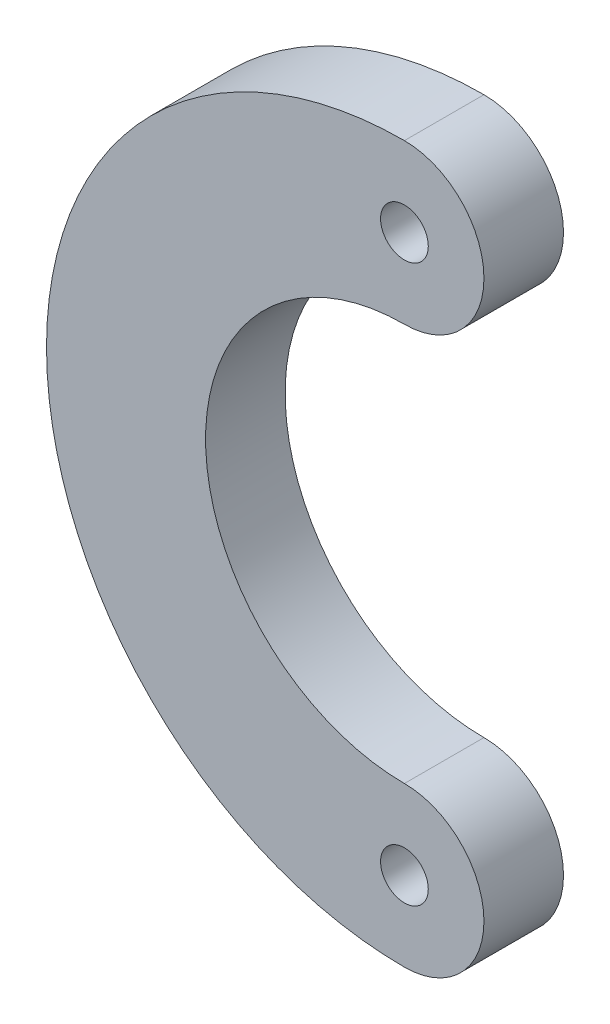
ISO-10303-21;
HEADER;
FILE_DESCRIPTION(('STEP AP214'),'2;1');
FILE_NAME('part.step','',(''),(''),'','','');
FILE_SCHEMA(('AUTOMOTIVE_DESIGN { 1 0 10303 214 1 1 1 1 }'));
ENDSEC;
DATA;
#1=APPLICATION_CONTEXT('core data for automotive mechanical design processes');
#2=APPLICATION_PROTOCOL_DEFINITION('international standard','automotive_design',2000,#1);
#3=PRODUCT_CONTEXT('',#1,'mechanical');
#4=PRODUCT('Part','Part','',(#3));
#5=PRODUCT_RELATED_PRODUCT_CATEGORY('part','',(#4));
#6=PRODUCT_DEFINITION_FORMATION('','',#4);
#7=PRODUCT_DEFINITION_CONTEXT('part definition',#1,'design');
#8=PRODUCT_DEFINITION('design','',#6,#7);
#9=PRODUCT_DEFINITION_SHAPE('','',#8);
#10=(LENGTH_UNIT() NAMED_UNIT(*) SI_UNIT(.MILLI.,.METRE.));
#11=(NAMED_UNIT(*) PLANE_ANGLE_UNIT() SI_UNIT($,.RADIAN.));
#12=(NAMED_UNIT(*) SI_UNIT($,.STERADIAN.) SOLID_ANGLE_UNIT());
#13=UNCERTAINTY_MEASURE_WITH_UNIT(LENGTH_MEASURE(1.E-05),#10,'distance_accuracy_value','');
#14=(GEOMETRIC_REPRESENTATION_CONTEXT(3) GLOBAL_UNCERTAINTY_ASSIGNED_CONTEXT((#13)) GLOBAL_UNIT_ASSIGNED_CONTEXT((#10,
#11,#12)) REPRESENTATION_CONTEXT('',''));
#15=CARTESIAN_POINT('',(0.,0.,0.));
#16=DIRECTION('',(0.,0.,1.));
#17=DIRECTION('',(1.,0.,0.));
#18=AXIS2_PLACEMENT_3D('',#15,#16,#17);
#19=CARTESIAN_POINT('',(0.,-17.5,5.));
#20=DIRECTION('',(0.,0.,-1.));
#21=DIRECTION('',(-1.,0.,0.));
#22=AXIS2_PLACEMENT_3D('',#19,#20,#21);
#23=CYLINDRICAL_SURFACE('',#22,5.);
#24=CARTESIAN_POINT('',(0.,-17.5,0.));
#25=DIRECTION('',(0.,0.,1.));
#26=DIRECTION('',(1.,0.,0.));
#27=AXIS2_PLACEMENT_3D('',#24,#25,#26);
#28=CIRCLE('',#27,5.);
#29=CARTESIAN_POINT('',(0.,-22.5,0.));
#30=VERTEX_POINT('',#29);
#31=CARTESIAN_POINT('',(0.,-12.5,0.));
#32=VERTEX_POINT('',#31);
#33=EDGE_CURVE('E98',#30,#32,#28,.T.);
#34=ORIENTED_EDGE('',*,*,#33,.T.);
#35=DIRECTION('',(0.,0.,-1.));
#36=VECTOR('',#35,1.);
#37=CARTESIAN_POINT('',(0.,-12.5,5.));
#38=LINE('',#37,#36);
#39=CARTESIAN_POINT('',(0.,-12.5,5.));
#40=VERTEX_POINT('',#39);
#41=EDGE_CURVE('E11',#40,#32,#38,.T.);
#42=ORIENTED_EDGE('',*,*,#41,.F.);
#43=CARTESIAN_POINT('',(0.,-17.5,5.));
#44=DIRECTION('',(0.,0.,1.));
#45=DIRECTION('',(1.,0.,0.));
#46=AXIS2_PLACEMENT_3D('',#43,#44,#45);
#47=CIRCLE('',#46,5.);
#48=CARTESIAN_POINT('',(0.,-22.5,5.));
#49=VERTEX_POINT('',#48);
#50=EDGE_CURVE('E86',#49,#40,#47,.T.);
#51=ORIENTED_EDGE('',*,*,#50,.F.);
#52=DIRECTION('',(0.,0.,-1.));
#53=VECTOR('',#52,1.);
#54=CARTESIAN_POINT('',(0.,-22.5,5.));
#55=LINE('',#54,#53);
#56=EDGE_CURVE('E94',#49,#30,#55,.T.);
#57=ORIENTED_EDGE('',*,*,#56,.T.);
#58=EDGE_LOOP('',(#34,#42,#51,#57));
#59=FACE_BOUND('',#58,.T.);
#60=ADVANCED_FACE('F35',(#59),#23,.T.);
#61=CARTESIAN_POINT('',(0.,0.,5.));
#62=DIRECTION('',(0.,0.,-1.));
#63=DIRECTION('',(-1.,0.,0.));
#64=AXIS2_PLACEMENT_3D('',#61,#62,#63);
#65=CYLINDRICAL_SURFACE('',#64,12.5);
#66=CARTESIAN_POINT('',(0.,0.,0.));
#67=DIRECTION('',(0.,0.,-1.));
#68=DIRECTION('',(1.,0.,0.));
#69=AXIS2_PLACEMENT_3D('',#66,#67,#68);
#70=CIRCLE('',#69,12.5);
#71=CARTESIAN_POINT('',(0.,12.5,0.));
#72=VERTEX_POINT('',#71);
#73=EDGE_CURVE('E90',#32,#72,#70,.T.);
#74=ORIENTED_EDGE('',*,*,#73,.T.);
#75=DIRECTION('',(0.,0.,-1.));
#76=VECTOR('',#75,1.);
#77=CARTESIAN_POINT('',(0.,12.5,5.));
#78=LINE('',#77,#76);
#79=CARTESIAN_POINT('',(0.,12.5,5.));
#80=VERTEX_POINT('',#79);
#81=EDGE_CURVE('E43',#80,#72,#78,.T.);
#82=ORIENTED_EDGE('',*,*,#81,.F.);
#83=CARTESIAN_POINT('',(0.,0.,5.));
#84=DIRECTION('',(0.,0.,-1.));
#85=DIRECTION('',(1.,0.,0.));
#86=AXIS2_PLACEMENT_3D('',#83,#84,#85);
#87=CIRCLE('',#86,12.5);
#88=EDGE_CURVE('E81',#40,#80,#87,.T.);
#89=ORIENTED_EDGE('',*,*,#88,.F.);
#90=ORIENTED_EDGE('',*,*,#41,.T.);
#91=EDGE_LOOP('',(#74,#82,#89,#90));
#92=FACE_BOUND('',#91,.T.);
#93=ADVANCED_FACE('F89',(#92),#65,.F.);
#94=CARTESIAN_POINT('',(0.,17.5,5.));
#95=DIRECTION('',(0.,0.,-1.));
#96=DIRECTION('',(-1.,0.,0.));
#97=AXIS2_PLACEMENT_3D('',#94,#95,#96);
#98=CYLINDRICAL_SURFACE('',#97,5.);
#99=CARTESIAN_POINT('',(0.,17.5,0.));
#100=DIRECTION('',(0.,0.,1.));
#101=DIRECTION('',(1.,0.,0.));
#102=AXIS2_PLACEMENT_3D('',#99,#100,#101);
#103=CIRCLE('',#102,5.);
#104=CARTESIAN_POINT('',(0.,22.5,0.));
#105=VERTEX_POINT('',#104);
#106=EDGE_CURVE('E68',#72,#105,#103,.T.);
#107=ORIENTED_EDGE('',*,*,#106,.T.);
#108=DIRECTION('',(0.,0.,-1.));
#109=VECTOR('',#108,1.);
#110=CARTESIAN_POINT('',(0.,22.5,5.));
#111=LINE('',#110,#109);
#112=CARTESIAN_POINT('',(0.,22.5,5.));
#113=VERTEX_POINT('',#112);
#114=EDGE_CURVE('E91',#113,#105,#111,.T.);
#115=ORIENTED_EDGE('',*,*,#114,.F.);
#116=CARTESIAN_POINT('',(0.,17.5,5.));
#117=DIRECTION('',(0.,0.,1.));
#118=DIRECTION('',(1.,0.,0.));
#119=AXIS2_PLACEMENT_3D('',#116,#117,#118);
#120=CIRCLE('',#119,5.);
#121=EDGE_CURVE('E84',#80,#113,#120,.T.);
#122=ORIENTED_EDGE('',*,*,#121,.F.);
#123=ORIENTED_EDGE('',*,*,#81,.T.);
#124=EDGE_LOOP('',(#107,#115,#122,#123));
#125=FACE_BOUND('',#124,.T.);
#126=ADVANCED_FACE('F92',(#125),#98,.T.);
#127=CARTESIAN_POINT('',(0.,0.,5.));
#128=DIRECTION('',(0.,0.,-1.));
#129=DIRECTION('',(-1.,0.,0.));
#130=AXIS2_PLACEMENT_3D('',#127,#128,#129);
#131=CYLINDRICAL_SURFACE('',#130,22.5);
#132=CARTESIAN_POINT('',(0.,0.,0.));
#133=DIRECTION('',(0.,0.,1.));
#134=DIRECTION('',(1.,0.,0.));
#135=AXIS2_PLACEMENT_3D('',#132,#133,#134);
#136=CIRCLE('',#135,22.5);
#137=EDGE_CURVE('E74',#105,#30,#136,.T.);
#138=ORIENTED_EDGE('',*,*,#137,.T.);
#139=ORIENTED_EDGE('',*,*,#56,.F.);
#140=CARTESIAN_POINT('',(0.,0.,5.));
#141=DIRECTION('',(0.,0.,1.));
#142=DIRECTION('',(1.,0.,0.));
#143=AXIS2_PLACEMENT_3D('',#140,#141,#142);
#144=CIRCLE('',#143,22.5);
#145=EDGE_CURVE('E51',#113,#49,#144,.T.);
#146=ORIENTED_EDGE('',*,*,#145,.F.);
#147=ORIENTED_EDGE('',*,*,#114,.T.);
#148=EDGE_LOOP('',(#138,#139,#146,#147));
#149=FACE_BOUND('',#148,.T.);
#150=ADVANCED_FACE('F106',(#149),#131,.T.);
#151=CARTESIAN_POINT('',(0.,-8.75,5.));
#152=DIRECTION('',(0.,0.,1.));
#153=DIRECTION('',(1.,0.,0.));
#154=AXIS2_PLACEMENT_3D('',#151,#152,#153);
#155=PLANE('',#154);
#156=CARTESIAN_POINT('',(0.,17.5,5.));
#157=DIRECTION('',(0.,0.,1.));
#158=DIRECTION('',(1.,0.,0.));
#159=AXIS2_PLACEMENT_3D('',#156,#157,#158);
#160=CIRCLE('',#159,1.5);
#161=CARTESIAN_POINT('',(1.5,17.5,5.));
#162=VERTEX_POINT('',#161);
#163=EDGE_CURVE('E120',#162,#162,#160,.T.);
#164=ORIENTED_EDGE('',*,*,#163,.F.);
#165=EDGE_LOOP('',(#164));
#166=FACE_BOUND('',#165,.T.);
#167=CARTESIAN_POINT('',(0.,-17.5,5.));
#168=DIRECTION('',(0.,0.,1.));
#169=DIRECTION('',(1.,0.,0.));
#170=AXIS2_PLACEMENT_3D('',#167,#168,#169);
#171=CIRCLE('',#170,1.5);
#172=CARTESIAN_POINT('',(1.5,-17.5,5.));
#173=VERTEX_POINT('',#172);
#174=EDGE_CURVE('E114',#173,#173,#171,.T.);
#175=ORIENTED_EDGE('',*,*,#174,.F.);
#176=EDGE_LOOP('',(#175));
#177=FACE_BOUND('',#176,.T.);
#178=ORIENTED_EDGE('',*,*,#50,.T.);
#179=ORIENTED_EDGE('',*,*,#88,.T.);
#180=ORIENTED_EDGE('',*,*,#121,.T.);
#181=ORIENTED_EDGE('',*,*,#145,.T.);
#182=EDGE_LOOP('',(#178,#179,#180,#181));
#183=FACE_BOUND('',#182,.T.);
#184=ADVANCED_FACE('F82',(#166,#177,#183),#155,.T.);
#185=CARTESIAN_POINT('',(0.,-8.75,0.));
#186=DIRECTION('',(0.,0.,1.));
#187=DIRECTION('',(1.,0.,0.));
#188=AXIS2_PLACEMENT_3D('',#185,#186,#187);
#189=PLANE('',#188);
#190=CARTESIAN_POINT('',(0.,17.5,0.));
#191=DIRECTION('',(0.,0.,1.));
#192=DIRECTION('',(1.,0.,0.));
#193=AXIS2_PLACEMENT_3D('',#190,#191,#192);
#194=CIRCLE('',#193,1.5);
#195=CARTESIAN_POINT('',(1.5,17.5,0.));
#196=VERTEX_POINT('',#195);
#197=EDGE_CURVE('E117',#196,#196,#194,.T.);
#198=ORIENTED_EDGE('',*,*,#197,.T.);
#199=EDGE_LOOP('',(#198));
#200=FACE_BOUND('',#199,.T.);
#201=CARTESIAN_POINT('',(0.,-17.5,0.));
#202=DIRECTION('',(0.,0.,1.));
#203=DIRECTION('',(1.,0.,0.));
#204=AXIS2_PLACEMENT_3D('',#201,#202,#203);
#205=CIRCLE('',#204,1.5);
#206=CARTESIAN_POINT('',(1.5,-17.5,0.));
#207=VERTEX_POINT('',#206);
#208=EDGE_CURVE('E101',#207,#207,#205,.T.);
#209=ORIENTED_EDGE('',*,*,#208,.T.);
#210=EDGE_LOOP('',(#209));
#211=FACE_BOUND('',#210,.T.);
#212=ORIENTED_EDGE('',*,*,#33,.F.);
#213=ORIENTED_EDGE('',*,*,#137,.F.);
#214=ORIENTED_EDGE('',*,*,#106,.F.);
#215=ORIENTED_EDGE('',*,*,#73,.F.);
#216=EDGE_LOOP('',(#212,#213,#214,#215));
#217=FACE_BOUND('',#216,.T.);
#218=ADVANCED_FACE('F109',(#200,#211,#217),#189,.F.);
#219=CARTESIAN_POINT('',(0.,-17.5,5.));
#220=DIRECTION('',(0.,0.,1.));
#221=DIRECTION('',(1.,0.,0.));
#222=AXIS2_PLACEMENT_3D('',#219,#220,#221);
#223=CYLINDRICAL_SURFACE('',#222,1.5);
#224=ORIENTED_EDGE('',*,*,#208,.F.);
#225=EDGE_LOOP('',(#224));
#226=FACE_BOUND('',#225,.T.);
#227=ORIENTED_EDGE('',*,*,#174,.T.);
#228=EDGE_LOOP('',(#227));
#229=FACE_BOUND('',#228,.T.);
#230=ADVANCED_FACE('F131',(#226,#229),#223,.F.);
#231=CARTESIAN_POINT('',(0.,17.5,5.));
#232=DIRECTION('',(0.,0.,1.));
#233=DIRECTION('',(1.,0.,0.));
#234=AXIS2_PLACEMENT_3D('',#231,#232,#233);
#235=CYLINDRICAL_SURFACE('',#234,1.5);
#236=ORIENTED_EDGE('',*,*,#197,.F.);
#237=EDGE_LOOP('',(#236));
#238=FACE_BOUND('',#237,.T.);
#239=ORIENTED_EDGE('',*,*,#163,.T.);
#240=EDGE_LOOP('',(#239));
#241=FACE_BOUND('',#240,.T.);
#242=ADVANCED_FACE('F124',(#238,#241),#235,.F.);
#243=CLOSED_SHELL('',(#60,#93,#126,#150,#184,#218,#230,#242));
#244=MANIFOLD_SOLID_BREP('B2',#243);
#245=ADVANCED_BREP_SHAPE_REPRESENTATION('',(#18,#244),#14);
#246=SHAPE_DEFINITION_REPRESENTATION(#9,#245);
ENDSEC;
END-ISO-10303-21;
